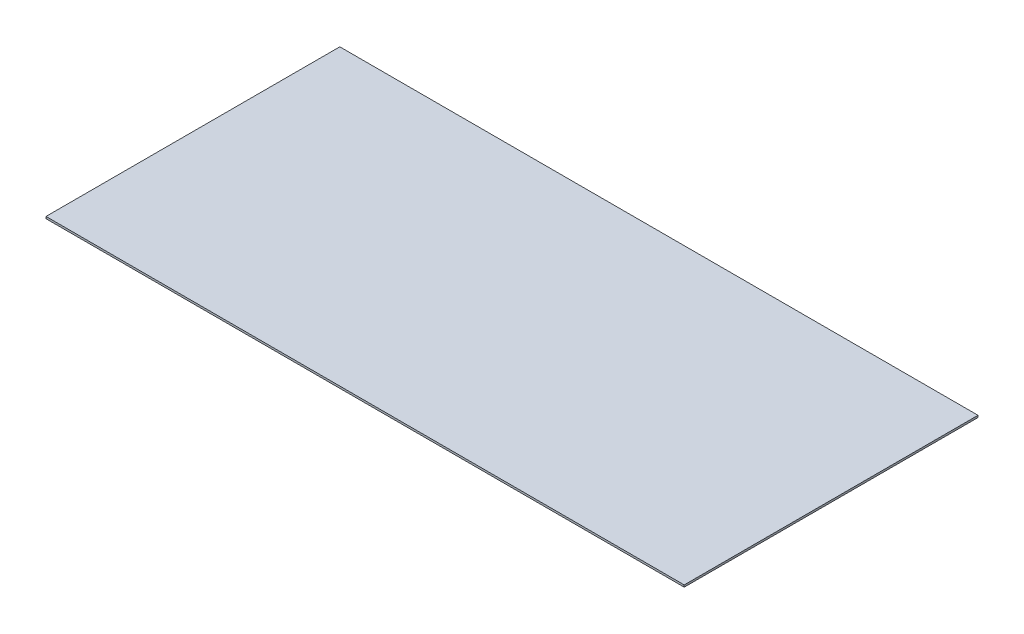
ISO-10303-21;
HEADER;
FILE_DESCRIPTION(('STEP AP214'),'2;1');
FILE_NAME('part.step','',(''),(''),'','','');
FILE_SCHEMA(('AUTOMOTIVE_DESIGN { 1 0 10303 214 1 1 1 1 }'));
ENDSEC;
DATA;
#1=APPLICATION_CONTEXT('core data for automotive mechanical design processes');
#2=APPLICATION_PROTOCOL_DEFINITION('international standard','automotive_design',2000,#1);
#3=PRODUCT_CONTEXT('',#1,'mechanical');
#4=PRODUCT('Part','Part','',(#3));
#5=PRODUCT_RELATED_PRODUCT_CATEGORY('part','',(#4));
#6=PRODUCT_DEFINITION_FORMATION('','',#4);
#7=PRODUCT_DEFINITION_CONTEXT('part definition',#1,'design');
#8=PRODUCT_DEFINITION('design','',#6,#7);
#9=PRODUCT_DEFINITION_SHAPE('','',#8);
#10=(LENGTH_UNIT() NAMED_UNIT(*) SI_UNIT(.MILLI.,.METRE.));
#11=(NAMED_UNIT(*) PLANE_ANGLE_UNIT() SI_UNIT($,.RADIAN.));
#12=(NAMED_UNIT(*) SI_UNIT($,.STERADIAN.) SOLID_ANGLE_UNIT());
#13=UNCERTAINTY_MEASURE_WITH_UNIT(LENGTH_MEASURE(1.E-05),#10,'distance_accuracy_value','');
#14=(GEOMETRIC_REPRESENTATION_CONTEXT(3) GLOBAL_UNCERTAINTY_ASSIGNED_CONTEXT((#13)) GLOBAL_UNIT_ASSIGNED_CONTEXT((#10,
#11,#12)) REPRESENTATION_CONTEXT('',''));
#15=CARTESIAN_POINT('',(0.,0.,0.));
#16=DIRECTION('',(0.,0.,1.));
#17=DIRECTION('',(1.,0.,0.));
#18=AXIS2_PLACEMENT_3D('',#15,#16,#17);
#19=CARTESIAN_POINT('',(0.,1.,0.));
#20=DIRECTION('',(1.,0.,0.));
#21=DIRECTION('',(0.,0.,-1.));
#22=AXIS2_PLACEMENT_3D('',#19,#20,#21);
#23=PLANE('',#22);
#24=DIRECTION('',(0.,0.,1.));
#25=VECTOR('',#24,1.);
#26=CARTESIAN_POINT('',(0.,0.,0.));
#27=LINE('',#26,#25);
#28=CARTESIAN_POINT('',(0.,0.,-147.32));
#29=VERTEX_POINT('',#28);
#30=CARTESIAN_POINT('',(0.,0.,0.));
#31=VERTEX_POINT('',#30);
#32=EDGE_CURVE('E99',#29,#31,#27,.T.);
#33=ORIENTED_EDGE('',*,*,#32,.T.);
#34=DIRECTION('',(0.,-1.,0.));
#35=VECTOR('',#34,1.);
#36=CARTESIAN_POINT('',(0.,1.,0.));
#37=LINE('',#36,#35);
#38=CARTESIAN_POINT('',(0.,1.,0.));
#39=VERTEX_POINT('',#38);
#40=EDGE_CURVE('E11',#39,#31,#37,.T.);
#41=ORIENTED_EDGE('',*,*,#40,.F.);
#42=DIRECTION('',(0.,0.,1.));
#43=VECTOR('',#42,1.);
#44=CARTESIAN_POINT('',(0.,1.,0.));
#45=LINE('',#44,#43);
#46=CARTESIAN_POINT('',(0.,1.,-147.32));
#47=VERTEX_POINT('',#46);
#48=EDGE_CURVE('E87',#47,#39,#45,.T.);
#49=ORIENTED_EDGE('',*,*,#48,.F.);
#50=DIRECTION('',(0.,-1.,0.));
#51=VECTOR('',#50,1.);
#52=CARTESIAN_POINT('',(0.,1.,-147.32));
#53=LINE('',#52,#51);
#54=EDGE_CURVE('E95',#47,#29,#53,.T.);
#55=ORIENTED_EDGE('',*,*,#54,.T.);
#56=EDGE_LOOP('',(#33,#41,#49,#55));
#57=FACE_BOUND('',#56,.T.);
#58=ADVANCED_FACE('F36',(#57),#23,.F.);
#59=CARTESIAN_POINT('',(0.,1.,0.));
#60=DIRECTION('',(0.,0.,-1.));
#61=DIRECTION('',(-1.,0.,0.));
#62=AXIS2_PLACEMENT_3D('',#59,#60,#61);
#63=PLANE('',#62);
#64=DIRECTION('',(1.,0.,0.));
#65=VECTOR('',#64,1.);
#66=CARTESIAN_POINT('',(0.,0.,0.));
#67=LINE('',#66,#65);
#68=CARTESIAN_POINT('',(320.04,0.,0.));
#69=VERTEX_POINT('',#68);
#70=EDGE_CURVE('E91',#31,#69,#67,.T.);
#71=ORIENTED_EDGE('',*,*,#70,.T.);
#72=DIRECTION('',(0.,-1.,0.));
#73=VECTOR('',#72,1.);
#74=CARTESIAN_POINT('',(320.04,1.,0.));
#75=LINE('',#74,#73);
#76=CARTESIAN_POINT('',(320.04,1.,0.));
#77=VERTEX_POINT('',#76);
#78=EDGE_CURVE('E44',#77,#69,#75,.T.);
#79=ORIENTED_EDGE('',*,*,#78,.F.);
#80=DIRECTION('',(1.,0.,0.));
#81=VECTOR('',#80,1.);
#82=CARTESIAN_POINT('',(0.,1.,0.));
#83=LINE('',#82,#81);
#84=EDGE_CURVE('E82',#39,#77,#83,.T.);
#85=ORIENTED_EDGE('',*,*,#84,.F.);
#86=ORIENTED_EDGE('',*,*,#40,.T.);
#87=EDGE_LOOP('',(#71,#79,#85,#86));
#88=FACE_BOUND('',#87,.T.);
#89=ADVANCED_FACE('F90',(#88),#63,.F.);
#90=CARTESIAN_POINT('',(320.04,1.,0.));
#91=DIRECTION('',(-1.,0.,0.));
#92=DIRECTION('',(0.,0.,1.));
#93=AXIS2_PLACEMENT_3D('',#90,#91,#92);
#94=PLANE('',#93);
#95=DIRECTION('',(0.,0.,-1.));
#96=VECTOR('',#95,1.);
#97=CARTESIAN_POINT('',(320.04,0.,0.));
#98=LINE('',#97,#96);
#99=CARTESIAN_POINT('',(320.04,0.,-147.32));
#100=VERTEX_POINT('',#99);
#101=EDGE_CURVE('E69',#69,#100,#98,.T.);
#102=ORIENTED_EDGE('',*,*,#101,.T.);
#103=DIRECTION('',(0.,-1.,0.));
#104=VECTOR('',#103,1.);
#105=CARTESIAN_POINT('',(320.04,1.,-147.32));
#106=LINE('',#105,#104);
#107=CARTESIAN_POINT('',(320.04,1.,-147.32));
#108=VERTEX_POINT('',#107);
#109=EDGE_CURVE('E92',#108,#100,#106,.T.);
#110=ORIENTED_EDGE('',*,*,#109,.F.);
#111=DIRECTION('',(0.,0.,-1.));
#112=VECTOR('',#111,1.);
#113=CARTESIAN_POINT('',(320.04,1.,0.));
#114=LINE('',#113,#112);
#115=EDGE_CURVE('E85',#77,#108,#114,.T.);
#116=ORIENTED_EDGE('',*,*,#115,.F.);
#117=ORIENTED_EDGE('',*,*,#78,.T.);
#118=EDGE_LOOP('',(#102,#110,#116,#117));
#119=FACE_BOUND('',#118,.T.);
#120=ADVANCED_FACE('F93',(#119),#94,.F.);
#121=CARTESIAN_POINT('',(0.,1.,-147.32));
#122=DIRECTION('',(0.,0.,1.));
#123=DIRECTION('',(1.,0.,0.));
#124=AXIS2_PLACEMENT_3D('',#121,#122,#123);
#125=PLANE('',#124);
#126=DIRECTION('',(-1.,0.,0.));
#127=VECTOR('',#126,1.);
#128=CARTESIAN_POINT('',(0.,0.,-147.32));
#129=LINE('',#128,#127);
#130=EDGE_CURVE('E75',#100,#29,#129,.T.);
#131=ORIENTED_EDGE('',*,*,#130,.T.);
#132=ORIENTED_EDGE('',*,*,#54,.F.);
#133=DIRECTION('',(-1.,0.,0.));
#134=VECTOR('',#133,1.);
#135=CARTESIAN_POINT('',(0.,1.,-147.32));
#136=LINE('',#135,#134);
#137=EDGE_CURVE('E52',#108,#47,#136,.T.);
#138=ORIENTED_EDGE('',*,*,#137,.F.);
#139=ORIENTED_EDGE('',*,*,#109,.T.);
#140=EDGE_LOOP('',(#131,#132,#138,#139));
#141=FACE_BOUND('',#140,.T.);
#142=ADVANCED_FACE('F106',(#141),#125,.F.);
#143=CARTESIAN_POINT('',(0.,1.,0.));
#144=DIRECTION('',(0.,-1.,0.));
#145=DIRECTION('',(0.,0.,-1.));
#146=AXIS2_PLACEMENT_3D('',#143,#144,#145);
#147=PLANE('',#146);
#148=ORIENTED_EDGE('',*,*,#48,.T.);
#149=ORIENTED_EDGE('',*,*,#84,.T.);
#150=ORIENTED_EDGE('',*,*,#115,.T.);
#151=ORIENTED_EDGE('',*,*,#137,.T.);
#152=EDGE_LOOP('',(#148,#149,#150,#151));
#153=FACE_BOUND('',#152,.T.);
#154=ADVANCED_FACE('F83',(#153),#147,.F.);
#155=CARTESIAN_POINT('',(0.,0.,0.));
#156=DIRECTION('',(0.,-1.,0.));
#157=DIRECTION('',(0.,0.,-1.));
#158=AXIS2_PLACEMENT_3D('',#155,#156,#157);
#159=PLANE('',#158);
#160=ORIENTED_EDGE('',*,*,#32,.F.);
#161=ORIENTED_EDGE('',*,*,#130,.F.);
#162=ORIENTED_EDGE('',*,*,#101,.F.);
#163=ORIENTED_EDGE('',*,*,#70,.F.);
#164=EDGE_LOOP('',(#160,#161,#162,#163));
#165=FACE_BOUND('',#164,.T.);
#166=ADVANCED_FACE('F109',(#165),#159,.T.);
#167=CLOSED_SHELL('',(#58,#89,#120,#142,#154,#166));
#168=MANIFOLD_SOLID_BREP('B2',#167);
#169=ADVANCED_BREP_SHAPE_REPRESENTATION('',(#18,#168),#14);
#170=SHAPE_DEFINITION_REPRESENTATION(#9,#169);
ENDSEC;
END-ISO-10303-21;
